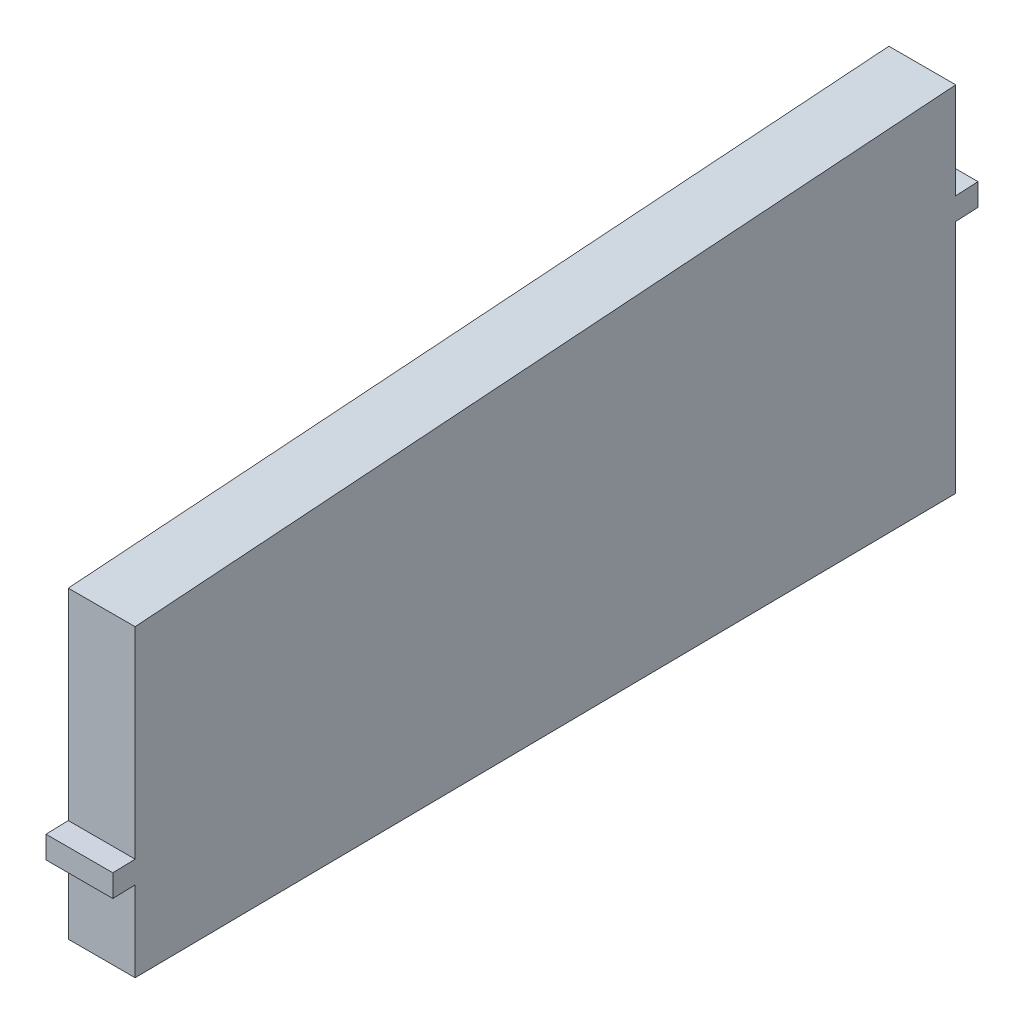
ISO-10303-21;
HEADER;
FILE_DESCRIPTION(('STEP AP214'),'2;1');
FILE_NAME('part.step','',(''),(''),'','','');
FILE_SCHEMA(('AUTOMOTIVE_DESIGN { 1 0 10303 214 1 1 1 1 }'));
ENDSEC;
DATA;
#1=APPLICATION_CONTEXT('core data for automotive mechanical design processes');
#2=APPLICATION_PROTOCOL_DEFINITION('international standard','automotive_design',2000,#1);
#3=PRODUCT_CONTEXT('',#1,'mechanical');
#4=PRODUCT('Part','Part','',(#3));
#5=PRODUCT_RELATED_PRODUCT_CATEGORY('part','',(#4));
#6=PRODUCT_DEFINITION_FORMATION('','',#4);
#7=PRODUCT_DEFINITION_CONTEXT('part definition',#1,'design');
#8=PRODUCT_DEFINITION('design','',#6,#7);
#9=PRODUCT_DEFINITION_SHAPE('','',#8);
#10=(LENGTH_UNIT() NAMED_UNIT(*) SI_UNIT(.MILLI.,.METRE.));
#11=(NAMED_UNIT(*) PLANE_ANGLE_UNIT() SI_UNIT($,.RADIAN.));
#12=(NAMED_UNIT(*) SI_UNIT($,.STERADIAN.) SOLID_ANGLE_UNIT());
#13=UNCERTAINTY_MEASURE_WITH_UNIT(LENGTH_MEASURE(1.E-05),#10,'distance_accuracy_value','');
#14=(GEOMETRIC_REPRESENTATION_CONTEXT(3) GLOBAL_UNCERTAINTY_ASSIGNED_CONTEXT((#13)) GLOBAL_UNIT_ASSIGNED_CONTEXT((#10,
#11,#12)) REPRESENTATION_CONTEXT('',''));
#15=CARTESIAN_POINT('',(0.,0.,0.));
#16=DIRECTION('',(0.,0.,1.));
#17=DIRECTION('',(1.,0.,0.));
#18=AXIS2_PLACEMENT_3D('',#15,#16,#17);
#19=CARTESIAN_POINT('',(243.017706630704,0.,0.));
#20=DIRECTION('',(1.,0.,0.));
#21=DIRECTION('',(0.,0.,-1.));
#22=AXIS2_PLACEMENT_3D('',#19,#20,#21);
#23=PLANE('',#22);
#24=DIRECTION('',(0.,-0.0302886855912018,0.999541192510422));
#25=VECTOR('',#24,1.);
#26=CARTESIAN_POINT('',(243.017706630704,373.849776180412,1017.12286065991));
#27=LINE('',#26,#25);
#28=CARTESIAN_POINT('',(243.017706630704,373.849776180412,1017.12286065991));
#29=VERTEX_POINT('',#28);
#30=CARTESIAN_POINT('',(243.017706630704,373.753565461461,1020.29786065991));
#31=VERTEX_POINT('',#30);
#32=EDGE_CURVE('E133',#29,#31,#27,.T.);
#33=ORIENTED_EDGE('',*,*,#32,.F.);
#34=DIRECTION('',(0.,-1.,0.));
#35=VECTOR('',#34,1.);
#36=CARTESIAN_POINT('',(243.017706630704,402.538478922115,1017.12286065991));
#37=LINE('',#36,#35);
#38=CARTESIAN_POINT('',(243.017706630704,402.538478922115,1017.12286065991));
#39=VERTEX_POINT('',#38);
#40=EDGE_CURVE('E169',#39,#29,#37,.T.);
#41=ORIENTED_EDGE('',*,*,#40,.F.);
#42=DIRECTION('',(0.,-0.0717092651883563,0.997425576815707));
#43=VECTOR('',#42,1.);
#44=CARTESIAN_POINT('',(243.017706630704,410.946223778431,900.177027495908));
#45=LINE('',#44,#43);
#46=CARTESIAN_POINT('',(243.017706630704,410.946223778431,900.177027495908));
#47=VERTEX_POINT('',#46);
#48=EDGE_CURVE('E166',#47,#39,#45,.T.);
#49=ORIENTED_EDGE('',*,*,#48,.F.);
#50=DIRECTION('',(0.,1.,0.));
#51=VECTOR('',#50,1.);
#52=CARTESIAN_POINT('',(243.017706630704,397.246183287948,900.177027495908));
#53=LINE('',#52,#51);
#54=CARTESIAN_POINT('',(243.017706630704,397.246183287948,900.177027495908));
#55=VERTEX_POINT('',#54);
#56=EDGE_CURVE('E163',#55,#47,#53,.T.);
#57=ORIENTED_EDGE('',*,*,#56,.F.);
#58=DIRECTION('',(0.,-0.0527109798388493,0.99860980998808));
#59=VECTOR('',#58,1.);
#60=CARTESIAN_POINT('',(243.017706630704,397.413773631358,897.002027495908));
#61=LINE('',#60,#59);
#62=CARTESIAN_POINT('',(243.017706630704,397.413773631358,897.002027495908));
#63=VERTEX_POINT('',#62);
#64=EDGE_CURVE('E160',#63,#55,#61,.T.);
#65=ORIENTED_EDGE('',*,*,#64,.F.);
#66=DIRECTION('',(0.,1.,0.));
#67=VECTOR('',#66,1.);
#68=CARTESIAN_POINT('',(243.017706630704,394.238773631358,897.002027495908));
#69=LINE('',#68,#67);
#70=CARTESIAN_POINT('',(243.017706630704,394.238773631358,897.002027495908));
#71=VERTEX_POINT('',#70);
#72=EDGE_CURVE('E157',#71,#63,#69,.T.);
#73=ORIENTED_EDGE('',*,*,#72,.F.);
#74=DIRECTION('',(0.,0.0527109798388319,-0.99860980998808));
#75=VECTOR('',#74,1.);
#76=CARTESIAN_POINT('',(243.017706630704,394.071183287948,900.177027495908));
#77=LINE('',#76,#75);
#78=CARTESIAN_POINT('',(243.017706630704,394.071183287948,900.177027495908));
#79=VERTEX_POINT('',#78);
#80=EDGE_CURVE('E154',#79,#71,#77,.T.);
#81=ORIENTED_EDGE('',*,*,#80,.F.);
#82=DIRECTION('',(0.,1.,0.));
#83=VECTOR('',#82,1.);
#84=CARTESIAN_POINT('',(243.017706630704,360.518497170758,900.177027495908));
#85=LINE('',#84,#83);
#86=CARTESIAN_POINT('',(243.017706630704,360.518497170758,900.177027495908));
#87=VERTEX_POINT('',#86);
#88=EDGE_CURVE('E151',#87,#79,#85,.T.);
#89=ORIENTED_EDGE('',*,*,#88,.F.);
#90=DIRECTION('',(0.,0.0111918962029081,-0.999937368768356));
#91=VECTOR('',#90,1.);
#92=CARTESIAN_POINT('',(243.017706630704,359.209569564876,1017.12286065991));
#93=LINE('',#92,#91);
#94=CARTESIAN_POINT('',(243.017706630704,359.209569564876,1017.12286065991));
#95=VERTEX_POINT('',#94);
#96=EDGE_CURVE('E148',#95,#87,#93,.T.);
#97=ORIENTED_EDGE('',*,*,#96,.F.);
#98=DIRECTION('',(0.,-1.,0.));
#99=VECTOR('',#98,1.);
#100=CARTESIAN_POINT('',(243.017706630704,370.674776180412,1017.12286065991));
#101=LINE('',#100,#99);
#102=CARTESIAN_POINT('',(243.017706630704,370.674776180412,1017.12286065991));
#103=VERTEX_POINT('',#102);
#104=EDGE_CURVE('E145',#103,#95,#101,.T.);
#105=ORIENTED_EDGE('',*,*,#104,.F.);
#106=DIRECTION('',(0.,0.0302886855911669,-0.999541192510424));
#107=VECTOR('',#106,1.);
#108=CARTESIAN_POINT('',(243.017706630704,370.578565461461,1020.29786065991));
#109=LINE('',#108,#107);
#110=CARTESIAN_POINT('',(243.017706630704,370.578565461461,1020.29786065991));
#111=VERTEX_POINT('',#110);
#112=EDGE_CURVE('E136',#111,#103,#109,.T.);
#113=ORIENTED_EDGE('',*,*,#112,.F.);
#114=DIRECTION('',(0.,-1.,0.));
#115=VECTOR('',#114,1.);
#116=CARTESIAN_POINT('',(243.017706630704,373.753565461461,1020.29786065991));
#117=LINE('',#116,#115);
#118=EDGE_CURVE('E125',#31,#111,#117,.T.);
#119=ORIENTED_EDGE('',*,*,#118,.F.);
#120=EDGE_LOOP('',(#33,#41,#49,#57,#65,#73,#81,#89,#97,#105,#113,#119));
#121=FACE_BOUND('',#120,.T.);
#122=ADVANCED_FACE('F33',(#121),#23,.F.);
#123=CARTESIAN_POINT('',(386.253378848063,402.538478922115,1017.12286065991));
#124=DIRECTION('',(0.,0.,-1.));
#125=DIRECTION('',(-1.,0.,0.));
#126=AXIS2_PLACEMENT_3D('',#123,#124,#125);
#127=PLANE('',#126);
#128=DIRECTION('',(-1.,0.,0.));
#129=VECTOR('',#128,1.);
#130=CARTESIAN_POINT('',(386.253378848063,373.849776180412,1017.12286065991));
#131=LINE('',#130,#129);
#132=CARTESIAN_POINT('',(252.542706630704,373.849776180412,1017.12286065991));
#133=VERTEX_POINT('',#132);
#134=EDGE_CURVE('E139',#133,#29,#131,.T.);
#135=ORIENTED_EDGE('',*,*,#134,.F.);
#136=DIRECTION('',(0.,1.,0.));
#137=VECTOR('',#136,1.);
#138=CARTESIAN_POINT('',(252.542706630704,402.538478922115,1017.12286065991));
#139=LINE('',#138,#137);
#140=CARTESIAN_POINT('',(252.542706630704,402.538478922115,1017.12286065991));
#141=VERTEX_POINT('',#140);
#142=EDGE_CURVE('E37',#133,#141,#139,.T.);
#143=ORIENTED_EDGE('',*,*,#142,.T.);
#144=DIRECTION('',(-1.,0.,0.));
#145=VECTOR('',#144,1.);
#146=CARTESIAN_POINT('',(386.253378848063,402.538478922115,1017.12286065991));
#147=LINE('',#146,#145);
#148=EDGE_CURVE('E172',#141,#39,#147,.T.);
#149=ORIENTED_EDGE('',*,*,#148,.T.);
#150=ORIENTED_EDGE('',*,*,#40,.T.);
#151=EDGE_LOOP('',(#135,#143,#149,#150));
#152=FACE_BOUND('',#151,.T.);
#153=ADVANCED_FACE('F221',(#152),#127,.F.);
#154=CARTESIAN_POINT('',(386.253378848063,410.946223778431,900.177027495908));
#155=DIRECTION('',(0.,-0.997425576815707,-0.0717092651883563));
#156=DIRECTION('',(0.,0.0717092651883563,-0.997425576815707));
#157=AXIS2_PLACEMENT_3D('',#154,#155,#156);
#158=PLANE('',#157);
#159=ORIENTED_EDGE('',*,*,#148,.F.);
#160=DIRECTION('',(0.,0.0717092651883563,-0.997425576815707));
#161=VECTOR('',#160,1.);
#162=CARTESIAN_POINT('',(252.542706630704,410.946223778431,900.177027495908));
#163=LINE('',#162,#161);
#164=CARTESIAN_POINT('',(252.542706630704,410.946223778431,900.177027495908));
#165=VERTEX_POINT('',#164);
#166=EDGE_CURVE('E215',#141,#165,#163,.T.);
#167=ORIENTED_EDGE('',*,*,#166,.T.);
#168=DIRECTION('',(-1.,0.,0.));
#169=VECTOR('',#168,1.);
#170=CARTESIAN_POINT('',(386.253378848063,410.946223778431,900.177027495908));
#171=LINE('',#170,#169);
#172=EDGE_CURVE('E174',#165,#47,#171,.T.);
#173=ORIENTED_EDGE('',*,*,#172,.T.);
#174=ORIENTED_EDGE('',*,*,#48,.T.);
#175=EDGE_LOOP('',(#159,#167,#173,#174));
#176=FACE_BOUND('',#175,.T.);
#177=ADVANCED_FACE('F224',(#176),#158,.F.);
#178=CARTESIAN_POINT('',(386.253378848063,397.246183287948,900.177027495908));
#179=DIRECTION('',(0.,0.,1.));
#180=DIRECTION('',(0.,-1.,0.));
#181=AXIS2_PLACEMENT_3D('',#178,#179,#180);
#182=PLANE('',#181);
#183=ORIENTED_EDGE('',*,*,#172,.F.);
#184=DIRECTION('',(0.,-1.,0.));
#185=VECTOR('',#184,1.);
#186=CARTESIAN_POINT('',(252.542706630704,397.246183287948,900.177027495908));
#187=LINE('',#186,#185);
#188=CARTESIAN_POINT('',(252.542706630704,397.246183287948,900.177027495908));
#189=VERTEX_POINT('',#188);
#190=EDGE_CURVE('E212',#165,#189,#187,.T.);
#191=ORIENTED_EDGE('',*,*,#190,.T.);
#192=DIRECTION('',(-1.,0.,0.));
#193=VECTOR('',#192,1.);
#194=CARTESIAN_POINT('',(386.253378848063,397.246183287948,900.177027495908));
#195=LINE('',#194,#193);
#196=EDGE_CURVE('E176',#189,#55,#195,.T.);
#197=ORIENTED_EDGE('',*,*,#196,.T.);
#198=ORIENTED_EDGE('',*,*,#56,.T.);
#199=EDGE_LOOP('',(#183,#191,#197,#198));
#200=FACE_BOUND('',#199,.T.);
#201=ADVANCED_FACE('F230',(#200),#182,.F.);
#202=CARTESIAN_POINT('',(386.253378848063,397.413773631358,897.002027495908));
#203=DIRECTION('',(0.,-0.99860980998808,-0.0527109798388493));
#204=DIRECTION('',(0.,0.0527109798388493,-0.99860980998808));
#205=AXIS2_PLACEMENT_3D('',#202,#203,#204);
#206=PLANE('',#205);
#207=ORIENTED_EDGE('',*,*,#196,.F.);
#208=DIRECTION('',(0.,0.0527109798388493,-0.99860980998808));
#209=VECTOR('',#208,1.);
#210=CARTESIAN_POINT('',(252.542706630704,397.413773631358,897.002027495908));
#211=LINE('',#210,#209);
#212=CARTESIAN_POINT('',(252.542706630704,397.413773631358,897.002027495908));
#213=VERTEX_POINT('',#212);
#214=EDGE_CURVE('E209',#189,#213,#211,.T.);
#215=ORIENTED_EDGE('',*,*,#214,.T.);
#216=DIRECTION('',(-1.,0.,0.));
#217=VECTOR('',#216,1.);
#218=CARTESIAN_POINT('',(386.253378848063,397.413773631358,897.002027495908));
#219=LINE('',#218,#217);
#220=EDGE_CURVE('E178',#213,#63,#219,.T.);
#221=ORIENTED_EDGE('',*,*,#220,.T.);
#222=ORIENTED_EDGE('',*,*,#64,.T.);
#223=EDGE_LOOP('',(#207,#215,#221,#222));
#224=FACE_BOUND('',#223,.T.);
#225=ADVANCED_FACE('F233',(#224),#206,.F.);
#226=CARTESIAN_POINT('',(386.253378848063,394.238773631358,897.002027495908));
#227=DIRECTION('',(0.,0.,1.));
#228=DIRECTION('',(1.,0.,0.));
#229=AXIS2_PLACEMENT_3D('',#226,#227,#228);
#230=PLANE('',#229);
#231=ORIENTED_EDGE('',*,*,#220,.F.);
#232=DIRECTION('',(0.,-1.,0.));
#233=VECTOR('',#232,1.);
#234=CARTESIAN_POINT('',(252.542706630704,394.238773631358,897.002027495908));
#235=LINE('',#234,#233);
#236=CARTESIAN_POINT('',(252.542706630704,394.238773631358,897.002027495908));
#237=VERTEX_POINT('',#236);
#238=EDGE_CURVE('E206',#213,#237,#235,.T.);
#239=ORIENTED_EDGE('',*,*,#238,.T.);
#240=DIRECTION('',(-1.,0.,0.));
#241=VECTOR('',#240,1.);
#242=CARTESIAN_POINT('',(386.253378848063,394.238773631358,897.002027495908));
#243=LINE('',#242,#241);
#244=EDGE_CURVE('E180',#237,#71,#243,.T.);
#245=ORIENTED_EDGE('',*,*,#244,.T.);
#246=ORIENTED_EDGE('',*,*,#72,.T.);
#247=EDGE_LOOP('',(#231,#239,#245,#246));
#248=FACE_BOUND('',#247,.T.);
#249=ADVANCED_FACE('F236',(#248),#230,.F.);
#250=CARTESIAN_POINT('',(386.253378848063,394.071183287948,900.177027495908));
#251=DIRECTION('',(0.,0.99860980998808,0.0527109798388319));
#252=DIRECTION('',(0.,-0.0527109798388319,0.998609809988081));
#253=AXIS2_PLACEMENT_3D('',#250,#251,#252);
#254=PLANE('',#253);
#255=ORIENTED_EDGE('',*,*,#244,.F.);
#256=DIRECTION('',(0.,-0.0527109798388319,0.998609809988081));
#257=VECTOR('',#256,1.);
#258=CARTESIAN_POINT('',(252.542706630704,394.071183287948,900.177027495908));
#259=LINE('',#258,#257);
#260=CARTESIAN_POINT('',(252.542706630704,394.071183287948,900.177027495908));
#261=VERTEX_POINT('',#260);
#262=EDGE_CURVE('E203',#237,#261,#259,.T.);
#263=ORIENTED_EDGE('',*,*,#262,.T.);
#264=DIRECTION('',(-1.,0.,0.));
#265=VECTOR('',#264,1.);
#266=CARTESIAN_POINT('',(386.253378848063,394.071183287948,900.177027495908));
#267=LINE('',#266,#265);
#268=EDGE_CURVE('E182',#261,#79,#267,.T.);
#269=ORIENTED_EDGE('',*,*,#268,.T.);
#270=ORIENTED_EDGE('',*,*,#80,.T.);
#271=EDGE_LOOP('',(#255,#263,#269,#270));
#272=FACE_BOUND('',#271,.T.);
#273=ADVANCED_FACE('F242',(#272),#254,.F.);
#274=CARTESIAN_POINT('',(386.253378848063,360.518497170758,900.177027495908));
#275=DIRECTION('',(0.,0.,1.));
#276=DIRECTION('',(1.,0.,0.));
#277=AXIS2_PLACEMENT_3D('',#274,#275,#276);
#278=PLANE('',#277);
#279=ORIENTED_EDGE('',*,*,#268,.F.);
#280=DIRECTION('',(0.,-1.,0.));
#281=VECTOR('',#280,1.);
#282=CARTESIAN_POINT('',(252.542706630704,360.518497170758,900.177027495908));
#283=LINE('',#282,#281);
#284=CARTESIAN_POINT('',(252.542706630704,360.518497170758,900.177027495908));
#285=VERTEX_POINT('',#284);
#286=EDGE_CURVE('E200',#261,#285,#283,.T.);
#287=ORIENTED_EDGE('',*,*,#286,.T.);
#288=DIRECTION('',(-1.,0.,0.));
#289=VECTOR('',#288,1.);
#290=CARTESIAN_POINT('',(386.253378848063,360.518497170758,900.177027495908));
#291=LINE('',#290,#289);
#292=EDGE_CURVE('E184',#285,#87,#291,.T.);
#293=ORIENTED_EDGE('',*,*,#292,.T.);
#294=ORIENTED_EDGE('',*,*,#88,.T.);
#295=EDGE_LOOP('',(#279,#287,#293,#294));
#296=FACE_BOUND('',#295,.T.);
#297=ADVANCED_FACE('F245',(#296),#278,.F.);
#298=CARTESIAN_POINT('',(386.253378848063,359.209569564876,1017.12286065991));
#299=DIRECTION('',(0.,0.999937368768356,0.0111918962029081));
#300=DIRECTION('',(0.,-0.0111918962029081,0.999937368768356));
#301=AXIS2_PLACEMENT_3D('',#298,#299,#300);
#302=PLANE('',#301);
#303=ORIENTED_EDGE('',*,*,#292,.F.);
#304=DIRECTION('',(0.,-0.0111918962029081,0.999937368768356));
#305=VECTOR('',#304,1.);
#306=CARTESIAN_POINT('',(252.542706630704,359.209569564876,1017.12286065991));
#307=LINE('',#306,#305);
#308=CARTESIAN_POINT('',(252.542706630704,359.209569564876,1017.12286065991));
#309=VERTEX_POINT('',#308);
#310=EDGE_CURVE('E195',#285,#309,#307,.T.);
#311=ORIENTED_EDGE('',*,*,#310,.T.);
#312=DIRECTION('',(-1.,0.,0.));
#313=VECTOR('',#312,1.);
#314=CARTESIAN_POINT('',(386.253378848063,359.209569564876,1017.12286065991));
#315=LINE('',#314,#313);
#316=EDGE_CURVE('E186',#309,#95,#315,.T.);
#317=ORIENTED_EDGE('',*,*,#316,.T.);
#318=ORIENTED_EDGE('',*,*,#96,.T.);
#319=EDGE_LOOP('',(#303,#311,#317,#318));
#320=FACE_BOUND('',#319,.T.);
#321=ADVANCED_FACE('F248',(#320),#302,.F.);
#322=CARTESIAN_POINT('',(386.253378848063,370.674776180412,1017.12286065991));
#323=DIRECTION('',(0.,0.,-1.));
#324=DIRECTION('',(-1.,0.,0.));
#325=AXIS2_PLACEMENT_3D('',#322,#323,#324);
#326=PLANE('',#325);
#327=ORIENTED_EDGE('',*,*,#316,.F.);
#328=DIRECTION('',(0.,1.,0.));
#329=VECTOR('',#328,1.);
#330=CARTESIAN_POINT('',(252.542706630704,370.674776180412,1017.12286065991));
#331=LINE('',#330,#329);
#332=CARTESIAN_POINT('',(252.542706630704,370.674776180412,1017.12286065991));
#333=VERTEX_POINT('',#332);
#334=EDGE_CURVE('E193',#309,#333,#331,.T.);
#335=ORIENTED_EDGE('',*,*,#334,.T.);
#336=DIRECTION('',(-1.,0.,0.));
#337=VECTOR('',#336,1.);
#338=CARTESIAN_POINT('',(386.253378848063,370.674776180412,1017.12286065991));
#339=LINE('',#338,#337);
#340=EDGE_CURVE('E188',#333,#103,#339,.T.);
#341=ORIENTED_EDGE('',*,*,#340,.T.);
#342=ORIENTED_EDGE('',*,*,#104,.T.);
#343=EDGE_LOOP('',(#327,#335,#341,#342));
#344=FACE_BOUND('',#343,.T.);
#345=ADVANCED_FACE('F251',(#344),#326,.F.);
#346=CARTESIAN_POINT('',(386.253378848063,370.578565461461,1020.29786065991));
#347=DIRECTION('',(0.,0.999541192510423,0.0302886855911669));
#348=DIRECTION('',(0.,-0.0302886855911669,0.999541192510424));
#349=AXIS2_PLACEMENT_3D('',#346,#347,#348);
#350=PLANE('',#349);
#351=ORIENTED_EDGE('',*,*,#340,.F.);
#352=DIRECTION('',(0.,-0.0302886855911669,0.999541192510424));
#353=VECTOR('',#352,1.);
#354=CARTESIAN_POINT('',(252.542706630704,370.578565461461,1020.29786065991));
#355=LINE('',#354,#353);
#356=CARTESIAN_POINT('',(252.542706630704,370.578565461461,1020.29786065991));
#357=VERTEX_POINT('',#356);
#358=EDGE_CURVE('E54',#333,#357,#355,.T.);
#359=ORIENTED_EDGE('',*,*,#358,.T.);
#360=DIRECTION('',(-1.,0.,0.));
#361=VECTOR('',#360,1.);
#362=CARTESIAN_POINT('',(386.253378848063,370.578565461461,1020.29786065991));
#363=LINE('',#362,#361);
#364=EDGE_CURVE('E129',#357,#111,#363,.T.);
#365=ORIENTED_EDGE('',*,*,#364,.T.);
#366=ORIENTED_EDGE('',*,*,#112,.T.);
#367=EDGE_LOOP('',(#351,#359,#365,#366));
#368=FACE_BOUND('',#367,.T.);
#369=ADVANCED_FACE('F191',(#368),#350,.F.);
#370=CARTESIAN_POINT('',(386.253378848063,373.753565461461,1020.29786065991));
#371=DIRECTION('',(0.,0.,-1.));
#372=DIRECTION('',(-1.,0.,0.));
#373=AXIS2_PLACEMENT_3D('',#370,#371,#372);
#374=PLANE('',#373);
#375=ORIENTED_EDGE('',*,*,#364,.F.);
#376=DIRECTION('',(0.,1.,0.));
#377=VECTOR('',#376,1.);
#378=CARTESIAN_POINT('',(252.542706630704,373.753565461461,1020.29786065991));
#379=LINE('',#378,#377);
#380=CARTESIAN_POINT('',(252.542706630704,373.753565461461,1020.29786065991));
#381=VERTEX_POINT('',#380);
#382=EDGE_CURVE('E42',#357,#381,#379,.T.);
#383=ORIENTED_EDGE('',*,*,#382,.T.);
#384=DIRECTION('',(-1.,0.,0.));
#385=VECTOR('',#384,1.);
#386=CARTESIAN_POINT('',(386.253378848063,373.753565461461,1020.29786065991));
#387=LINE('',#386,#385);
#388=EDGE_CURVE('E122',#381,#31,#387,.T.);
#389=ORIENTED_EDGE('',*,*,#388,.T.);
#390=ORIENTED_EDGE('',*,*,#118,.T.);
#391=EDGE_LOOP('',(#375,#383,#389,#390));
#392=FACE_BOUND('',#391,.T.);
#393=ADVANCED_FACE('F124',(#392),#374,.F.);
#394=CARTESIAN_POINT('',(386.253378848063,373.849776180412,1017.12286065991));
#395=DIRECTION('',(0.,-0.999541192510422,-0.0302886855912018));
#396=DIRECTION('',(0.,0.0302886855912018,-0.999541192510422));
#397=AXIS2_PLACEMENT_3D('',#394,#395,#396);
#398=PLANE('',#397);
#399=ORIENTED_EDGE('',*,*,#388,.F.);
#400=DIRECTION('',(0.,0.0302886855912018,-0.999541192510423));
#401=VECTOR('',#400,1.);
#402=CARTESIAN_POINT('',(252.542706630704,373.849776180412,1017.12286065991));
#403=LINE('',#402,#401);
#404=EDGE_CURVE('E11',#381,#133,#403,.T.);
#405=ORIENTED_EDGE('',*,*,#404,.T.);
#406=ORIENTED_EDGE('',*,*,#134,.T.);
#407=ORIENTED_EDGE('',*,*,#32,.T.);
#408=EDGE_LOOP('',(#399,#405,#406,#407));
#409=FACE_BOUND('',#408,.T.);
#410=ADVANCED_FACE('F35',(#409),#398,.F.);
#411=CARTESIAN_POINT('',(252.542706630704,344.83433889611,776.881194154094));
#412=DIRECTION('',(-1.,0.,0.));
#413=DIRECTION('',(0.,0.,1.));
#414=AXIS2_PLACEMENT_3D('',#411,#412,#413);
#415=PLANE('',#414);
#416=ORIENTED_EDGE('',*,*,#382,.F.);
#417=ORIENTED_EDGE('',*,*,#358,.F.);
#418=ORIENTED_EDGE('',*,*,#334,.F.);
#419=ORIENTED_EDGE('',*,*,#310,.F.);
#420=ORIENTED_EDGE('',*,*,#286,.F.);
#421=ORIENTED_EDGE('',*,*,#262,.F.);
#422=ORIENTED_EDGE('',*,*,#238,.F.);
#423=ORIENTED_EDGE('',*,*,#214,.F.);
#424=ORIENTED_EDGE('',*,*,#190,.F.);
#425=ORIENTED_EDGE('',*,*,#166,.F.);
#426=ORIENTED_EDGE('',*,*,#142,.F.);
#427=ORIENTED_EDGE('',*,*,#404,.F.);
#428=EDGE_LOOP('',(#416,#417,#418,#419,#420,#421,#422,#423,#424,#425,#426,#427));
#429=FACE_BOUND('',#428,.T.);
#430=ADVANCED_FACE('F222',(#429),#415,.F.);
#431=CLOSED_SHELL('',(#122,#153,#177,#201,#225,#249,#273,#297,#321,#345,#369,#393,#410,#430));
#432=MANIFOLD_SOLID_BREP('B2',#431);
#433=ADVANCED_BREP_SHAPE_REPRESENTATION('',(#18,#432),#14);
#434=SHAPE_DEFINITION_REPRESENTATION(#9,#433);
ENDSEC;
END-ISO-10303-21;
